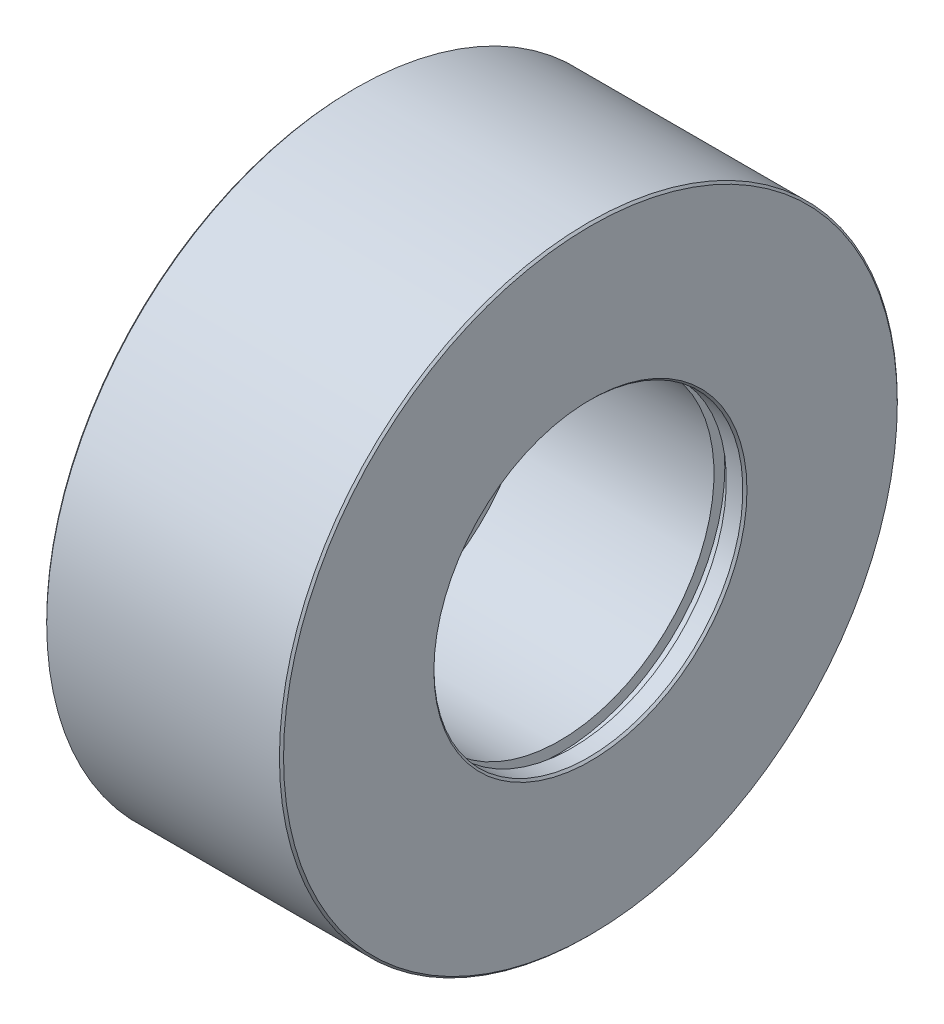
ISO-10303-21;
HEADER;
FILE_DESCRIPTION(('STEP AP214'),'2;1');
FILE_NAME('part.step','',(''),(''),'','','');
FILE_SCHEMA(('AUTOMOTIVE_DESIGN { 1 0 10303 214 1 1 1 1 }'));
ENDSEC;
DATA;
#1=APPLICATION_CONTEXT('core data for automotive mechanical design processes');
#2=APPLICATION_PROTOCOL_DEFINITION('international standard','automotive_design',2000,#1);
#3=PRODUCT_CONTEXT('',#1,'mechanical');
#4=PRODUCT('Part','Part','',(#3));
#5=PRODUCT_RELATED_PRODUCT_CATEGORY('part','',(#4));
#6=PRODUCT_DEFINITION_FORMATION('','',#4);
#7=PRODUCT_DEFINITION_CONTEXT('part definition',#1,'design');
#8=PRODUCT_DEFINITION('design','',#6,#7);
#9=PRODUCT_DEFINITION_SHAPE('','',#8);
#10=(LENGTH_UNIT() NAMED_UNIT(*) SI_UNIT(.MILLI.,.METRE.));
#11=(NAMED_UNIT(*) PLANE_ANGLE_UNIT() SI_UNIT($,.RADIAN.));
#12=(NAMED_UNIT(*) SI_UNIT($,.STERADIAN.) SOLID_ANGLE_UNIT());
#13=UNCERTAINTY_MEASURE_WITH_UNIT(LENGTH_MEASURE(1.E-05),#10,'distance_accuracy_value','');
#14=(GEOMETRIC_REPRESENTATION_CONTEXT(3) GLOBAL_UNCERTAINTY_ASSIGNED_CONTEXT((#13)) GLOBAL_UNIT_ASSIGNED_CONTEXT((#10,
#11,#12)) REPRESENTATION_CONTEXT('',''));
#15=CARTESIAN_POINT('',(0.,0.,0.));
#16=DIRECTION('',(0.,0.,1.));
#17=DIRECTION('',(1.,0.,0.));
#18=AXIS2_PLACEMENT_3D('',#15,#16,#17);
#19=CARTESIAN_POINT('',(0.,30.,0.));
#20=DIRECTION('',(1.,0.,0.));
#21=DIRECTION('',(0.,0.,-1.));
#22=AXIS2_PLACEMENT_3D('',#19,#20,#21);
#23=PLANE('',#22);
#24=CARTESIAN_POINT('',(0.,0.,0.));
#25=DIRECTION('',(1.,0.,0.));
#26=DIRECTION('',(0.,0.,-1.));
#27=AXIS2_PLACEMENT_3D('',#24,#25,#26);
#28=CIRCLE('',#27,13.7);
#29=CARTESIAN_POINT('',(0.,0.,-13.7));
#30=VERTEX_POINT('',#29);
#31=EDGE_CURVE('E56',#30,#30,#28,.T.);
#32=ORIENTED_EDGE('',*,*,#31,.T.);
#33=EDGE_LOOP('',(#32));
#34=FACE_BOUND('',#33,.T.);
#35=CARTESIAN_POINT('',(0.,0.,0.));
#36=DIRECTION('',(1.,0.,0.));
#37=DIRECTION('',(0.,0.,-1.));
#38=AXIS2_PLACEMENT_3D('',#35,#36,#37);
#39=CIRCLE('',#38,29.8);
#40=CARTESIAN_POINT('',(0.,0.,-29.8));
#41=VERTEX_POINT('',#40);
#42=EDGE_CURVE('E59',#41,#41,#39,.F.);
#43=ORIENTED_EDGE('',*,*,#42,.T.);
#44=EDGE_LOOP('',(#43));
#45=FACE_BOUND('',#44,.T.);
#46=ADVANCED_FACE('F32',(#34,#45),#23,.F.);
#47=CARTESIAN_POINT('',(0.,0.,0.));
#48=DIRECTION('',(-1.,0.,0.));
#49=DIRECTION('',(0.,0.,1.));
#50=AXIS2_PLACEMENT_3D('',#47,#48,#49);
#51=CYLINDRICAL_SURFACE('',#50,13.5);
#52=CARTESIAN_POINT('',(1.8,0.,0.));
#53=DIRECTION('',(-1.,0.,0.));
#54=DIRECTION('',(0.,0.,1.));
#55=AXIS2_PLACEMENT_3D('',#52,#53,#54);
#56=CIRCLE('',#55,13.5);
#57=CARTESIAN_POINT('',(1.8,0.,13.5));
#58=VERTEX_POINT('',#57);
#59=EDGE_CURVE('E62',#58,#58,#56,.F.);
#60=ORIENTED_EDGE('',*,*,#59,.T.);
#61=EDGE_LOOP('',(#60));
#62=FACE_BOUND('',#61,.T.);
#63=CARTESIAN_POINT('',(0.200000000000015,0.,0.));
#64=DIRECTION('',(1.,0.,0.));
#65=DIRECTION('',(0.,0.,-1.));
#66=AXIS2_PLACEMENT_3D('',#63,#64,#65);
#67=CIRCLE('',#66,13.5);
#68=CARTESIAN_POINT('',(0.200000000000015,0.,-13.5));
#69=VERTEX_POINT('',#68);
#70=EDGE_CURVE('E65',#69,#69,#67,.F.);
#71=ORIENTED_EDGE('',*,*,#70,.T.);
#72=EDGE_LOOP('',(#71));
#73=FACE_BOUND('',#72,.T.);
#74=ADVANCED_FACE('F115',(#62,#73),#51,.F.);
#75=CARTESIAN_POINT('',(1.99999999999999,13.5,0.));
#76=DIRECTION('',(-1.,0.,0.));
#77=DIRECTION('',(0.,0.,1.));
#78=AXIS2_PLACEMENT_3D('',#75,#76,#77);
#79=PLANE('',#78);
#80=CARTESIAN_POINT('',(1.99999999999999,0.,0.));
#81=DIRECTION('',(-1.,0.,0.));
#82=DIRECTION('',(0.,0.,1.));
#83=AXIS2_PLACEMENT_3D('',#80,#81,#82);
#84=CIRCLE('',#83,13.7);
#85=CARTESIAN_POINT('',(1.99999999999999,0.,13.7));
#86=VERTEX_POINT('',#85);
#87=EDGE_CURVE('E68',#86,#86,#84,.T.);
#88=ORIENTED_EDGE('',*,*,#87,.T.);
#89=EDGE_LOOP('',(#88));
#90=FACE_BOUND('',#89,.T.);
#91=CARTESIAN_POINT('',(1.99999999999999,0.,0.));
#92=DIRECTION('',(-1.,0.,0.));
#93=DIRECTION('',(0.,0.,1.));
#94=AXIS2_PLACEMENT_3D('',#91,#92,#93);
#95=CIRCLE('',#94,15.);
#96=CARTESIAN_POINT('',(1.99999999999999,0.,15.));
#97=VERTEX_POINT('',#96);
#98=EDGE_CURVE('E71',#97,#97,#95,.T.);
#99=ORIENTED_EDGE('',*,*,#98,.F.);
#100=EDGE_LOOP('',(#99));
#101=FACE_BOUND('',#100,.T.);
#102=ADVANCED_FACE('F110',(#90,#101),#79,.F.);
#103=CARTESIAN_POINT('',(0.,0.,0.));
#104=DIRECTION('',(-1.,0.,0.));
#105=DIRECTION('',(0.,0.,1.));
#106=AXIS2_PLACEMENT_3D('',#103,#104,#105);
#107=CYLINDRICAL_SURFACE('',#106,15.);
#108=CARTESIAN_POINT('',(20.,0.,0.));
#109=DIRECTION('',(-1.,0.,0.));
#110=DIRECTION('',(0.,0.,1.));
#111=AXIS2_PLACEMENT_3D('',#108,#109,#110);
#112=CIRCLE('',#111,15.);
#113=CARTESIAN_POINT('',(20.,0.,15.));
#114=VERTEX_POINT('',#113);
#115=EDGE_CURVE('E74',#114,#114,#112,.T.);
#116=ORIENTED_EDGE('',*,*,#115,.F.);
#117=EDGE_LOOP('',(#116));
#118=FACE_BOUND('',#117,.T.);
#119=ORIENTED_EDGE('',*,*,#98,.T.);
#120=EDGE_LOOP('',(#119));
#121=FACE_BOUND('',#120,.T.);
#122=ADVANCED_FACE('F104',(#118,#121),#107,.F.);
#123=CARTESIAN_POINT('',(20.,16.05,0.));
#124=DIRECTION('',(-1.,0.,0.));
#125=DIRECTION('',(0.,0.,1.));
#126=AXIS2_PLACEMENT_3D('',#123,#124,#125);
#127=PLANE('',#126);
#128=CARTESIAN_POINT('',(20.,0.,0.));
#129=DIRECTION('',(-1.,0.,0.));
#130=DIRECTION('',(0.,0.,1.));
#131=AXIS2_PLACEMENT_3D('',#128,#129,#130);
#132=CIRCLE('',#131,16.05);
#133=CARTESIAN_POINT('',(20.,0.,16.05));
#134=VERTEX_POINT('',#133);
#135=EDGE_CURVE('E77',#134,#134,#132,.T.);
#136=ORIENTED_EDGE('',*,*,#135,.F.);
#137=EDGE_LOOP('',(#136));
#138=FACE_BOUND('',#137,.T.);
#139=ORIENTED_EDGE('',*,*,#115,.T.);
#140=EDGE_LOOP('',(#139));
#141=FACE_BOUND('',#140,.T.);
#142=ADVANCED_FACE('F98',(#138,#141),#127,.F.);
#143=CARTESIAN_POINT('',(0.,0.,0.));
#144=DIRECTION('',(-1.,0.,0.));
#145=DIRECTION('',(0.,0.,1.));
#146=AXIS2_PLACEMENT_3D('',#143,#144,#145);
#147=CYLINDRICAL_SURFACE('',#146,16.05);
#148=CARTESIAN_POINT('',(21.2,0.,0.));
#149=DIRECTION('',(-1.,0.,0.));
#150=DIRECTION('',(0.,0.,1.));
#151=AXIS2_PLACEMENT_3D('',#148,#149,#150);
#152=CIRCLE('',#151,16.05);
#153=CARTESIAN_POINT('',(21.2,0.,16.05));
#154=VERTEX_POINT('',#153);
#155=EDGE_CURVE('E80',#154,#154,#152,.T.);
#156=ORIENTED_EDGE('',*,*,#155,.F.);
#157=EDGE_LOOP('',(#156));
#158=FACE_BOUND('',#157,.T.);
#159=ORIENTED_EDGE('',*,*,#135,.T.);
#160=EDGE_LOOP('',(#159));
#161=FACE_BOUND('',#160,.T.);
#162=ADVANCED_FACE('F92',(#158,#161),#147,.F.);
#163=CARTESIAN_POINT('',(21.2,15.,0.));
#164=DIRECTION('',(1.,0.,0.));
#165=DIRECTION('',(0.,0.,-1.));
#166=AXIS2_PLACEMENT_3D('',#163,#164,#165);
#167=PLANE('',#166);
#168=CARTESIAN_POINT('',(21.2,0.,0.));
#169=DIRECTION('',(-1.,0.,0.));
#170=DIRECTION('',(0.,0.,1.));
#171=AXIS2_PLACEMENT_3D('',#168,#169,#170);
#172=CIRCLE('',#171,15.);
#173=CARTESIAN_POINT('',(21.2,0.,15.));
#174=VERTEX_POINT('',#173);
#175=EDGE_CURVE('E83',#174,#174,#172,.T.);
#176=ORIENTED_EDGE('',*,*,#175,.F.);
#177=EDGE_LOOP('',(#176));
#178=FACE_BOUND('',#177,.T.);
#179=ORIENTED_EDGE('',*,*,#155,.T.);
#180=EDGE_LOOP('',(#179));
#181=FACE_BOUND('',#180,.T.);
#182=ADVANCED_FACE('F89',(#178,#181),#167,.F.);
#183=CARTESIAN_POINT('',(0.,0.,0.));
#184=DIRECTION('',(-1.,0.,0.));
#185=DIRECTION('',(0.,0.,1.));
#186=AXIS2_PLACEMENT_3D('',#183,#184,#185);
#187=CYLINDRICAL_SURFACE('',#186,15.);
#188=CARTESIAN_POINT('',(22.8,0.,0.));
#189=DIRECTION('',(-1.,0.,0.));
#190=DIRECTION('',(0.,0.,1.));
#191=AXIS2_PLACEMENT_3D('',#188,#189,#190);
#192=CIRCLE('',#191,15.);
#193=CARTESIAN_POINT('',(22.8,0.,15.));
#194=VERTEX_POINT('',#193);
#195=EDGE_CURVE('E44',#194,#194,#192,.F.);
#196=ORIENTED_EDGE('',*,*,#195,.T.);
#197=EDGE_LOOP('',(#196));
#198=FACE_BOUND('',#197,.T.);
#199=ORIENTED_EDGE('',*,*,#175,.T.);
#200=EDGE_LOOP('',(#199));
#201=FACE_BOUND('',#200,.T.);
#202=ADVANCED_FACE('F87',(#198,#201),#187,.F.);
#203=CARTESIAN_POINT('',(23.,15.,0.));
#204=DIRECTION('',(-1.,0.,0.));
#205=DIRECTION('',(0.,0.,1.));
#206=AXIS2_PLACEMENT_3D('',#203,#204,#205);
#207=PLANE('',#206);
#208=CARTESIAN_POINT('',(23.,0.,0.));
#209=DIRECTION('',(-1.,0.,0.));
#210=DIRECTION('',(0.,0.,1.));
#211=AXIS2_PLACEMENT_3D('',#208,#209,#210);
#212=CIRCLE('',#211,15.2);
#213=CARTESIAN_POINT('',(23.,0.,15.2));
#214=VERTEX_POINT('',#213);
#215=EDGE_CURVE('E48',#214,#214,#212,.T.);
#216=ORIENTED_EDGE('',*,*,#215,.T.);
#217=EDGE_LOOP('',(#216));
#218=FACE_BOUND('',#217,.T.);
#219=CARTESIAN_POINT('',(23.,0.,0.));
#220=DIRECTION('',(-1.,0.,0.));
#221=DIRECTION('',(0.,0.,1.));
#222=AXIS2_PLACEMENT_3D('',#219,#220,#221);
#223=CIRCLE('',#222,29.8);
#224=CARTESIAN_POINT('',(23.,0.,29.8));
#225=VERTEX_POINT('',#224);
#226=EDGE_CURVE('E53',#225,#225,#223,.F.);
#227=ORIENTED_EDGE('',*,*,#226,.T.);
#228=EDGE_LOOP('',(#227));
#229=FACE_BOUND('',#228,.T.);
#230=ADVANCED_FACE('F168',(#218,#229),#207,.F.);
#231=CARTESIAN_POINT('',(0.,0.,0.));
#232=DIRECTION('',(-1.,0.,0.));
#233=DIRECTION('',(0.,0.,1.));
#234=AXIS2_PLACEMENT_3D('',#231,#232,#233);
#235=CYLINDRICAL_SURFACE('',#234,30.);
#236=CARTESIAN_POINT('',(0.20000000000002,0.,0.));
#237=DIRECTION('',(1.,0.,0.));
#238=DIRECTION('',(0.,0.,-1.));
#239=AXIS2_PLACEMENT_3D('',#236,#237,#238);
#240=CIRCLE('',#239,30.);
#241=CARTESIAN_POINT('',(0.20000000000002,0.,-30.));
#242=VERTEX_POINT('',#241);
#243=EDGE_CURVE('E10',#242,#242,#240,.T.);
#244=ORIENTED_EDGE('',*,*,#243,.T.);
#245=EDGE_LOOP('',(#244));
#246=FACE_BOUND('',#245,.T.);
#247=CARTESIAN_POINT('',(22.8,0.,0.));
#248=DIRECTION('',(-1.,0.,0.));
#249=DIRECTION('',(0.,0.,1.));
#250=AXIS2_PLACEMENT_3D('',#247,#248,#249);
#251=CIRCLE('',#250,30.);
#252=CARTESIAN_POINT('',(22.8,0.,30.));
#253=VERTEX_POINT('',#252);
#254=EDGE_CURVE('E40',#253,#253,#251,.T.);
#255=ORIENTED_EDGE('',*,*,#254,.T.);
#256=EDGE_LOOP('',(#255));
#257=FACE_BOUND('',#256,.T.);
#258=ADVANCED_FACE('F138',(#246,#257),#235,.T.);
#259=CARTESIAN_POINT('',(1.99999999999999,0.,0.));
#260=DIRECTION('',(1.,0.,0.));
#261=DIRECTION('',(0.,0.,-1.));
#262=AXIS2_PLACEMENT_3D('',#259,#260,#261);
#263=CONICAL_SURFACE('',#262,13.7,0.785398163397453);
#264=ORIENTED_EDGE('',*,*,#59,.F.);
#265=EDGE_LOOP('',(#264));
#266=FACE_BOUND('',#265,.T.);
#267=ORIENTED_EDGE('',*,*,#87,.F.);
#268=EDGE_LOOP('',(#267));
#269=FACE_BOUND('',#268,.T.);
#270=ADVANCED_FACE('F131',(#266,#269),#263,.F.);
#271=CARTESIAN_POINT('',(0.200000000000015,0.,0.));
#272=DIRECTION('',(-1.,0.,0.));
#273=DIRECTION('',(0.,0.,1.));
#274=AXIS2_PLACEMENT_3D('',#271,#272,#273);
#275=CONICAL_SURFACE('',#274,13.5,0.785398163397418);
#276=ORIENTED_EDGE('',*,*,#31,.F.);
#277=EDGE_LOOP('',(#276));
#278=FACE_BOUND('',#277,.T.);
#279=ORIENTED_EDGE('',*,*,#70,.F.);
#280=EDGE_LOOP('',(#279));
#281=FACE_BOUND('',#280,.T.);
#282=ADVANCED_FACE('F137',(#278,#281),#275,.F.);
#283=CARTESIAN_POINT('',(23.,0.,0.));
#284=DIRECTION('',(1.,0.,0.));
#285=DIRECTION('',(0.,0.,-1.));
#286=AXIS2_PLACEMENT_3D('',#283,#284,#285);
#287=CONICAL_SURFACE('',#286,15.2,0.785398163397435);
#288=ORIENTED_EDGE('',*,*,#195,.F.);
#289=EDGE_LOOP('',(#288));
#290=FACE_BOUND('',#289,.T.);
#291=ORIENTED_EDGE('',*,*,#215,.F.);
#292=EDGE_LOOP('',(#291));
#293=FACE_BOUND('',#292,.T.);
#294=ADVANCED_FACE('F145',(#290,#293),#287,.F.);
#295=CARTESIAN_POINT('',(0.,0.,0.));
#296=DIRECTION('',(1.,0.,0.));
#297=DIRECTION('',(0.,0.,-1.));
#298=AXIS2_PLACEMENT_3D('',#295,#296,#297);
#299=CONICAL_SURFACE('',#298,29.8,0.785398163397448);
#300=ORIENTED_EDGE('',*,*,#243,.F.);
#301=EDGE_LOOP('',(#300));
#302=FACE_BOUND('',#301,.T.);
#303=ORIENTED_EDGE('',*,*,#42,.F.);
#304=EDGE_LOOP('',(#303));
#305=FACE_BOUND('',#304,.T.);
#306=ADVANCED_FACE('F151',(#302,#305),#299,.T.);
#307=CARTESIAN_POINT('',(22.8,0.,0.));
#308=DIRECTION('',(-1.,0.,0.));
#309=DIRECTION('',(0.,0.,1.));
#310=AXIS2_PLACEMENT_3D('',#307,#308,#309);
#311=CONICAL_SURFACE('',#310,30.,0.78539816339744);
#312=ORIENTED_EDGE('',*,*,#226,.F.);
#313=EDGE_LOOP('',(#312));
#314=FACE_BOUND('',#313,.T.);
#315=ORIENTED_EDGE('',*,*,#254,.F.);
#316=EDGE_LOOP('',(#315));
#317=FACE_BOUND('',#316,.T.);
#318=ADVANCED_FACE('F35',(#314,#317),#311,.T.);
#319=CLOSED_SHELL('',(#46,#74,#102,#122,#142,#162,#182,#202,#230,#258,#270,#282,#294,#306,#318));
#320=MANIFOLD_SOLID_BREP('B2',#319);
#321=ADVANCED_BREP_SHAPE_REPRESENTATION('',(#18,#320),#14);
#322=SHAPE_DEFINITION_REPRESENTATION(#9,#321);
ENDSEC;
END-ISO-10303-21;
